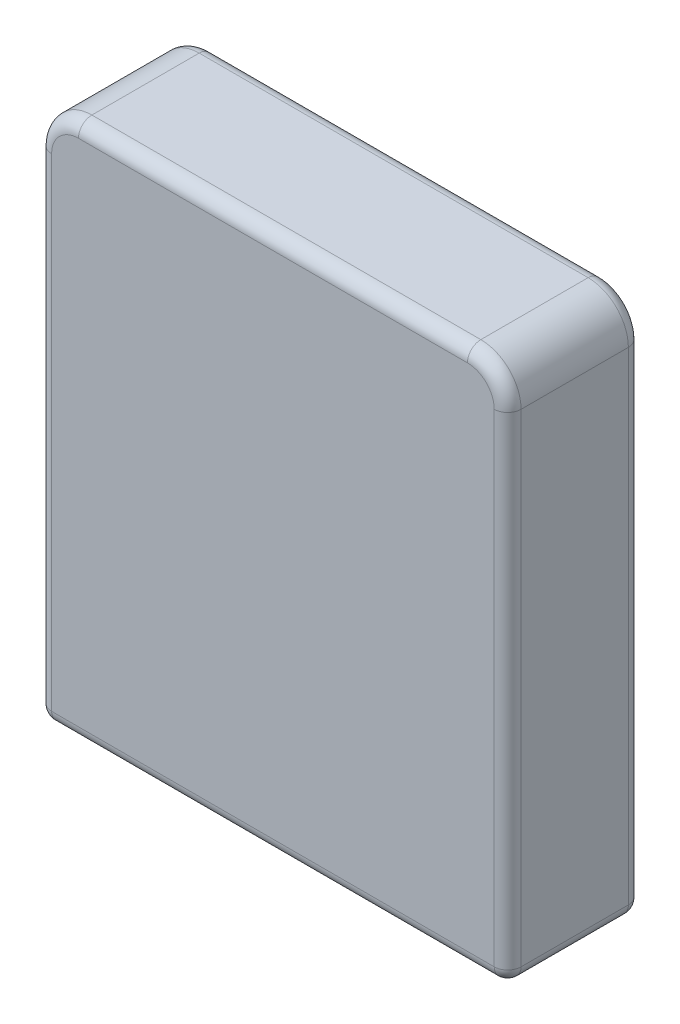
ISO-10303-21;
HEADER;
FILE_DESCRIPTION(('STEP AP214'),'2;1');
FILE_NAME('part.step','',(''),(''),'','','');
FILE_SCHEMA(('AUTOMOTIVE_DESIGN { 1 0 10303 214 1 1 1 1 }'));
ENDSEC;
DATA;
#1=APPLICATION_CONTEXT('core data for automotive mechanical design processes');
#2=APPLICATION_PROTOCOL_DEFINITION('international standard','automotive_design',2000,#1);
#3=PRODUCT_CONTEXT('',#1,'mechanical');
#4=PRODUCT('Part','Part','',(#3));
#5=PRODUCT_RELATED_PRODUCT_CATEGORY('part','',(#4));
#6=PRODUCT_DEFINITION_FORMATION('','',#4);
#7=PRODUCT_DEFINITION_CONTEXT('part definition',#1,'design');
#8=PRODUCT_DEFINITION('design','',#6,#7);
#9=PRODUCT_DEFINITION_SHAPE('','',#8);
#10=(LENGTH_UNIT() NAMED_UNIT(*) SI_UNIT(.MILLI.,.METRE.));
#11=(NAMED_UNIT(*) PLANE_ANGLE_UNIT() SI_UNIT($,.RADIAN.));
#12=(NAMED_UNIT(*) SI_UNIT($,.STERADIAN.) SOLID_ANGLE_UNIT());
#13=UNCERTAINTY_MEASURE_WITH_UNIT(LENGTH_MEASURE(1.E-05),#10,'distance_accuracy_value','');
#14=(GEOMETRIC_REPRESENTATION_CONTEXT(3) GLOBAL_UNCERTAINTY_ASSIGNED_CONTEXT((#13)) GLOBAL_UNIT_ASSIGNED_CONTEXT((#10,
#11,#12)) REPRESENTATION_CONTEXT('',''));
#15=CARTESIAN_POINT('',(0.,0.,0.));
#16=DIRECTION('',(0.,0.,1.));
#17=DIRECTION('',(1.,0.,0.));
#18=AXIS2_PLACEMENT_3D('',#15,#16,#17);
#19=CARTESIAN_POINT('',(0.,0.,10.));
#20=DIRECTION('',(1.,0.,0.));
#21=DIRECTION('',(0.,1.,0.));
#22=AXIS2_PLACEMENT_3D('',#19,#20,#21);
#23=PLANE('',#22);
#24=DIRECTION('',(0.,0.,-1.));
#25=VECTOR('',#24,1.);
#26=CARTESIAN_POINT('',(0.,1.,10.));
#27=LINE('',#26,#25);
#28=CARTESIAN_POINT('',(0.,1.,0.999999999999999));
#29=VERTEX_POINT('',#28);
#30=CARTESIAN_POINT('',(0.,1.,9.));
#31=VERTEX_POINT('',#30);
#32=EDGE_CURVE('E280',#29,#31,#27,.F.);
#33=ORIENTED_EDGE('',*,*,#32,.T.);
#34=DIRECTION('',(0.,-1.,0.));
#35=VECTOR('',#34,1.);
#36=CARTESIAN_POINT('',(0.,0.,9.));
#37=LINE('',#36,#35);
#38=CARTESIAN_POINT('',(0.,37.,9.));
#39=VERTEX_POINT('',#38);
#40=EDGE_CURVE('E284',#31,#39,#37,.F.);
#41=ORIENTED_EDGE('',*,*,#40,.T.);
#42=DIRECTION('',(0.,0.,-1.));
#43=VECTOR('',#42,1.);
#44=CARTESIAN_POINT('',(0.,37.,10.));
#45=LINE('',#44,#43);
#46=CARTESIAN_POINT('',(0.,37.,0.999999999999999));
#47=VERTEX_POINT('',#46);
#48=EDGE_CURVE('E267',#39,#47,#45,.T.);
#49=ORIENTED_EDGE('',*,*,#48,.T.);
#50=DIRECTION('',(0.,-1.,0.));
#51=VECTOR('',#50,1.);
#52=CARTESIAN_POINT('',(0.,0.,0.999999999999999));
#53=LINE('',#52,#51);
#54=EDGE_CURVE('E282',#47,#29,#53,.T.);
#55=ORIENTED_EDGE('',*,*,#54,.T.);
#56=EDGE_LOOP('',(#33,#41,#49,#55));
#57=FACE_BOUND('',#56,.T.);
#58=ADVANCED_FACE('F35',(#57),#23,.F.);
#59=CARTESIAN_POINT('',(0.,0.,10.));
#60=DIRECTION('',(0.,1.,0.));
#61=DIRECTION('',(0.,0.,1.));
#62=AXIS2_PLACEMENT_3D('',#59,#60,#61);
#63=PLANE('',#62);
#64=DIRECTION('',(1.,0.,0.));
#65=VECTOR('',#64,1.);
#66=CARTESIAN_POINT('',(0.,0.,9.));
#67=LINE('',#66,#65);
#68=CARTESIAN_POINT('',(34.,0.,9.));
#69=VERTEX_POINT('',#68);
#70=CARTESIAN_POINT('',(1.,0.,9.));
#71=VERTEX_POINT('',#70);
#72=EDGE_CURVE('E326',#69,#71,#67,.F.);
#73=ORIENTED_EDGE('',*,*,#72,.T.);
#74=DIRECTION('',(0.,0.,-1.));
#75=VECTOR('',#74,1.);
#76=CARTESIAN_POINT('',(1.,0.,10.));
#77=LINE('',#76,#75);
#78=CARTESIAN_POINT('',(1.,0.,0.999999999999999));
#79=VERTEX_POINT('',#78);
#80=EDGE_CURVE('E328',#71,#79,#77,.T.);
#81=ORIENTED_EDGE('',*,*,#80,.T.);
#82=DIRECTION('',(1.,0.,0.));
#83=VECTOR('',#82,1.);
#84=CARTESIAN_POINT('',(4.5,0.,0.999999999999999));
#85=LINE('',#84,#83);
#86=CARTESIAN_POINT('',(4.5,0.,0.999999999999999));
#87=VERTEX_POINT('',#86);
#88=EDGE_CURVE('E314',#79,#87,#85,.T.);
#89=ORIENTED_EDGE('',*,*,#88,.T.);
#90=CARTESIAN_POINT('',(4.5,0.,-1.));
#91=DIRECTION('',(0.,1.,0.));
#92=DIRECTION('',(0.,0.,1.));
#93=AXIS2_PLACEMENT_3D('',#90,#91,#92);
#94=CIRCLE('',#93,2.);
#95=CARTESIAN_POINT('',(6.5,0.,-1.));
#96=VERTEX_POINT('',#95);
#97=EDGE_CURVE('E316',#87,#96,#94,.T.);
#98=ORIENTED_EDGE('',*,*,#97,.T.);
#99=DIRECTION('',(1.,0.,0.));
#100=VECTOR('',#99,1.);
#101=CARTESIAN_POINT('',(28.5,0.,-1.));
#102=LINE('',#101,#100);
#103=CARTESIAN_POINT('',(28.5,0.,-1.));
#104=VERTEX_POINT('',#103);
#105=EDGE_CURVE('E318',#96,#104,#102,.T.);
#106=ORIENTED_EDGE('',*,*,#105,.T.);
#107=CARTESIAN_POINT('',(30.5,0.,-1.));
#108=DIRECTION('',(0.,1.,0.));
#109=DIRECTION('',(0.,0.,1.));
#110=AXIS2_PLACEMENT_3D('',#107,#108,#109);
#111=CIRCLE('',#110,2.);
#112=CARTESIAN_POINT('',(30.5,0.,1.));
#113=VERTEX_POINT('',#112);
#114=EDGE_CURVE('E320',#104,#113,#111,.T.);
#115=ORIENTED_EDGE('',*,*,#114,.T.);
#116=DIRECTION('',(1.,0.,0.));
#117=VECTOR('',#116,1.);
#118=CARTESIAN_POINT('',(35.,0.,0.999999999999999));
#119=LINE('',#118,#117);
#120=CARTESIAN_POINT('',(34.,0.,0.999999999999999));
#121=VERTEX_POINT('',#120);
#122=EDGE_CURVE('E322',#113,#121,#119,.T.);
#123=ORIENTED_EDGE('',*,*,#122,.T.);
#124=DIRECTION('',(0.,0.,-1.));
#125=VECTOR('',#124,1.);
#126=CARTESIAN_POINT('',(34.,0.,10.));
#127=LINE('',#126,#125);
#128=EDGE_CURVE('E324',#121,#69,#127,.F.);
#129=ORIENTED_EDGE('',*,*,#128,.T.);
#130=EDGE_LOOP('',(#73,#81,#89,#98,#106,#115,#123,#129));
#131=FACE_BOUND('',#130,.T.);
#132=ADVANCED_FACE('F525',(#131),#63,.F.);
#133=CARTESIAN_POINT('',(35.,0.,10.));
#134=DIRECTION('',(-1.,0.,0.));
#135=DIRECTION('',(0.,-1.,0.));
#136=AXIS2_PLACEMENT_3D('',#133,#134,#135);
#137=PLANE('',#136);
#138=DIRECTION('',(0.,0.,-1.));
#139=VECTOR('',#138,1.);
#140=CARTESIAN_POINT('',(35.,37.,10.));
#141=LINE('',#140,#139);
#142=CARTESIAN_POINT('',(35.,37.,0.999999999999999));
#143=VERTEX_POINT('',#142);
#144=CARTESIAN_POINT('',(35.,37.,9.));
#145=VERTEX_POINT('',#144);
#146=EDGE_CURVE('E209',#143,#145,#141,.F.);
#147=ORIENTED_EDGE('',*,*,#146,.T.);
#148=DIRECTION('',(0.,1.,0.));
#149=VECTOR('',#148,1.);
#150=CARTESIAN_POINT('',(35.,0.,9.));
#151=LINE('',#150,#149);
#152=CARTESIAN_POINT('',(35.,1.,9.));
#153=VERTEX_POINT('',#152);
#154=EDGE_CURVE('E335',#145,#153,#151,.F.);
#155=ORIENTED_EDGE('',*,*,#154,.T.);
#156=DIRECTION('',(0.,0.,-1.));
#157=VECTOR('',#156,1.);
#158=CARTESIAN_POINT('',(35.,1.,10.));
#159=LINE('',#158,#157);
#160=CARTESIAN_POINT('',(35.,1.,0.999999999999999));
#161=VERTEX_POINT('',#160);
#162=EDGE_CURVE('E333',#153,#161,#159,.T.);
#163=ORIENTED_EDGE('',*,*,#162,.T.);
#164=DIRECTION('',(0.,1.,0.));
#165=VECTOR('',#164,1.);
#166=CARTESIAN_POINT('',(35.,37.,0.999999999999999));
#167=LINE('',#166,#165);
#168=EDGE_CURVE('E331',#161,#143,#167,.T.);
#169=ORIENTED_EDGE('',*,*,#168,.T.);
#170=EDGE_LOOP('',(#147,#155,#163,#169));
#171=FACE_BOUND('',#170,.T.);
#172=ADVANCED_FACE('F495',(#171),#137,.F.);
#173=CARTESIAN_POINT('',(0.,40.,10.));
#174=DIRECTION('',(0.,-1.,0.));
#175=DIRECTION('',(0.,0.,-1.));
#176=AXIS2_PLACEMENT_3D('',#173,#174,#175);
#177=PLANE('',#176);
#178=DIRECTION('',(0.,0.,-1.));
#179=VECTOR('',#178,1.);
#180=CARTESIAN_POINT('',(2.99999999999999,40.,10.));
#181=LINE('',#180,#179);
#182=CARTESIAN_POINT('',(2.99999999999999,40.,0.999999999999999));
#183=VERTEX_POINT('',#182);
#184=CARTESIAN_POINT('',(2.99999999999999,40.,9.));
#185=VERTEX_POINT('',#184);
#186=EDGE_CURVE('E482',#183,#185,#181,.F.);
#187=ORIENTED_EDGE('',*,*,#186,.T.);
#188=DIRECTION('',(-1.,0.,0.));
#189=VECTOR('',#188,1.);
#190=CARTESIAN_POINT('',(0.,40.,9.));
#191=LINE('',#190,#189);
#192=CARTESIAN_POINT('',(32.,40.,9.));
#193=VERTEX_POINT('',#192);
#194=EDGE_CURVE('E293',#185,#193,#191,.F.);
#195=ORIENTED_EDGE('',*,*,#194,.T.);
#196=DIRECTION('',(0.,0.,-1.));
#197=VECTOR('',#196,1.);
#198=CARTESIAN_POINT('',(32.,40.,10.));
#199=LINE('',#198,#197);
#200=CARTESIAN_POINT('',(32.,40.,0.999999999999999));
#201=VERTEX_POINT('',#200);
#202=EDGE_CURVE('E485',#193,#201,#199,.T.);
#203=ORIENTED_EDGE('',*,*,#202,.T.);
#204=DIRECTION('',(-1.,0.,0.));
#205=VECTOR('',#204,1.);
#206=CARTESIAN_POINT('',(2.99999999999999,40.,0.999999999999999));
#207=LINE('',#206,#205);
#208=EDGE_CURVE('E291',#201,#183,#207,.T.);
#209=ORIENTED_EDGE('',*,*,#208,.T.);
#210=EDGE_LOOP('',(#187,#195,#203,#209));
#211=FACE_BOUND('',#210,.T.);
#212=ADVANCED_FACE('F594',(#211),#177,.F.);
#213=CARTESIAN_POINT('',(0.,0.,10.));
#214=DIRECTION('',(0.,0.,-1.));
#215=DIRECTION('',(-1.,0.,0.));
#216=AXIS2_PLACEMENT_3D('',#213,#214,#215);
#217=PLANE('',#216);
#218=CARTESIAN_POINT('',(2.99999999999999,37.,10.));
#219=DIRECTION('',(0.,0.,-1.));
#220=DIRECTION('',(-1.,0.,0.));
#221=AXIS2_PLACEMENT_3D('',#218,#219,#220);
#222=CIRCLE('',#221,2.);
#223=CARTESIAN_POINT('',(2.99999999999999,39.,10.));
#224=VERTEX_POINT('',#223);
#225=CARTESIAN_POINT('',(0.999999999999994,37.,10.));
#226=VERTEX_POINT('',#225);
#227=EDGE_CURVE('E275',#224,#226,#222,.F.);
#228=ORIENTED_EDGE('',*,*,#227,.T.);
#229=DIRECTION('',(0.,-1.,0.));
#230=VECTOR('',#229,1.);
#231=CARTESIAN_POINT('',(1.,0.,10.));
#232=LINE('',#231,#230);
#233=CARTESIAN_POINT('',(1.,1.,10.));
#234=VERTEX_POINT('',#233);
#235=EDGE_CURVE('E277',#226,#234,#232,.T.);
#236=ORIENTED_EDGE('',*,*,#235,.T.);
#237=DIRECTION('',(1.,0.,0.));
#238=VECTOR('',#237,1.);
#239=CARTESIAN_POINT('',(0.,1.,10.));
#240=LINE('',#239,#238);
#241=CARTESIAN_POINT('',(34.,1.,10.));
#242=VERTEX_POINT('',#241);
#243=EDGE_CURVE('E269',#234,#242,#240,.T.);
#244=ORIENTED_EDGE('',*,*,#243,.T.);
#245=DIRECTION('',(0.,1.,0.));
#246=VECTOR('',#245,1.);
#247=CARTESIAN_POINT('',(34.,0.,10.));
#248=LINE('',#247,#246);
#249=CARTESIAN_POINT('',(34.,37.,10.));
#250=VERTEX_POINT('',#249);
#251=EDGE_CURVE('E240',#242,#250,#248,.T.);
#252=ORIENTED_EDGE('',*,*,#251,.T.);
#253=CARTESIAN_POINT('',(32.,37.,10.));
#254=DIRECTION('',(0.,0.,-1.));
#255=DIRECTION('',(-1.,0.,0.));
#256=AXIS2_PLACEMENT_3D('',#253,#254,#255);
#257=CIRCLE('',#256,2.);
#258=CARTESIAN_POINT('',(32.,39.,10.));
#259=VERTEX_POINT('',#258);
#260=EDGE_CURVE('E271',#250,#259,#257,.F.);
#261=ORIENTED_EDGE('',*,*,#260,.T.);
#262=DIRECTION('',(-1.,0.,0.));
#263=VECTOR('',#262,1.);
#264=CARTESIAN_POINT('',(0.,39.,10.));
#265=LINE('',#264,#263);
#266=EDGE_CURVE('E273',#259,#224,#265,.T.);
#267=ORIENTED_EDGE('',*,*,#266,.T.);
#268=EDGE_LOOP('',(#228,#236,#244,#252,#261,#267));
#269=FACE_BOUND('',#268,.T.);
#270=ADVANCED_FACE('F512',(#269),#217,.F.);
#271=CARTESIAN_POINT('',(0.,0.,0.));
#272=DIRECTION('',(0.,0.,-1.));
#273=DIRECTION('',(-1.,0.,0.));
#274=AXIS2_PLACEMENT_3D('',#271,#272,#273);
#275=PLANE('',#274);
#276=DIRECTION('',(0.,-1.,0.));
#277=VECTOR('',#276,1.);
#278=CARTESIAN_POINT('',(4.5,0.,0.));
#279=LINE('',#278,#277);
#280=CARTESIAN_POINT('',(4.5,33.,0.));
#281=VERTEX_POINT('',#280);
#282=CARTESIAN_POINT('',(4.5,1.,0.));
#283=VERTEX_POINT('',#282);
#284=EDGE_CURVE('E229',#281,#283,#279,.T.);
#285=ORIENTED_EDGE('',*,*,#284,.T.);
#286=DIRECTION('',(1.,0.,0.));
#287=VECTOR('',#286,1.);
#288=CARTESIAN_POINT('',(0.,1.,0.));
#289=LINE('',#288,#287);
#290=CARTESIAN_POINT('',(1.,1.,0.));
#291=VERTEX_POINT('',#290);
#292=EDGE_CURVE('E312',#283,#291,#289,.F.);
#293=ORIENTED_EDGE('',*,*,#292,.T.);
#294=DIRECTION('',(0.,-1.,0.));
#295=VECTOR('',#294,1.);
#296=CARTESIAN_POINT('',(0.999999999999994,37.,0.));
#297=LINE('',#296,#295);
#298=CARTESIAN_POINT('',(0.999999999999994,37.,0.));
#299=VERTEX_POINT('',#298);
#300=EDGE_CURVE('E309',#291,#299,#297,.F.);
#301=ORIENTED_EDGE('',*,*,#300,.T.);
#302=CARTESIAN_POINT('',(2.99999999999999,37.,0.));
#303=DIRECTION('',(0.,0.,-1.));
#304=DIRECTION('',(-1.,0.,0.));
#305=AXIS2_PLACEMENT_3D('',#302,#303,#304);
#306=CIRCLE('',#305,2.);
#307=CARTESIAN_POINT('',(2.99999999999999,39.,0.));
#308=VERTEX_POINT('',#307);
#309=EDGE_CURVE('E307',#299,#308,#306,.T.);
#310=ORIENTED_EDGE('',*,*,#309,.T.);
#311=DIRECTION('',(-1.,0.,0.));
#312=VECTOR('',#311,1.);
#313=CARTESIAN_POINT('',(32.,39.,0.));
#314=LINE('',#313,#312);
#315=CARTESIAN_POINT('',(32.,39.,0.));
#316=VERTEX_POINT('',#315);
#317=EDGE_CURVE('E305',#308,#316,#314,.F.);
#318=ORIENTED_EDGE('',*,*,#317,.T.);
#319=CARTESIAN_POINT('',(32.,37.,0.));
#320=DIRECTION('',(0.,0.,-1.));
#321=DIRECTION('',(-1.,0.,0.));
#322=AXIS2_PLACEMENT_3D('',#319,#320,#321);
#323=CIRCLE('',#322,2.);
#324=CARTESIAN_POINT('',(34.,37.,0.));
#325=VERTEX_POINT('',#324);
#326=EDGE_CURVE('E303',#316,#325,#323,.T.);
#327=ORIENTED_EDGE('',*,*,#326,.T.);
#328=DIRECTION('',(0.,1.,0.));
#329=VECTOR('',#328,1.);
#330=CARTESIAN_POINT('',(34.,0.,0.));
#331=LINE('',#330,#329);
#332=CARTESIAN_POINT('',(34.,1.,0.));
#333=VERTEX_POINT('',#332);
#334=EDGE_CURVE('E299',#325,#333,#331,.F.);
#335=ORIENTED_EDGE('',*,*,#334,.T.);
#336=DIRECTION('',(1.,0.,0.));
#337=VECTOR('',#336,1.);
#338=CARTESIAN_POINT('',(30.5,1.,0.));
#339=LINE('',#338,#337);
#340=CARTESIAN_POINT('',(30.5,1.,0.));
#341=VERTEX_POINT('',#340);
#342=EDGE_CURVE('E301',#333,#341,#339,.F.);
#343=ORIENTED_EDGE('',*,*,#342,.T.);
#344=DIRECTION('',(0.,-1.,0.));
#345=VECTOR('',#344,1.);
#346=CARTESIAN_POINT('',(30.5,34.,0.));
#347=LINE('',#346,#345);
#348=CARTESIAN_POINT('',(30.5,33.,0.));
#349=VERTEX_POINT('',#348);
#350=EDGE_CURVE('E205',#341,#349,#347,.F.);
#351=ORIENTED_EDGE('',*,*,#350,.T.);
#352=CARTESIAN_POINT('',(28.5,33.,0.));
#353=DIRECTION('',(0.,0.,-1.));
#354=DIRECTION('',(-1.,0.,0.));
#355=AXIS2_PLACEMENT_3D('',#352,#353,#354);
#356=CIRCLE('',#355,2.);
#357=CARTESIAN_POINT('',(28.5,35.,0.));
#358=VERTEX_POINT('',#357);
#359=EDGE_CURVE('E197',#358,#349,#356,.T.);
#360=ORIENTED_EDGE('',*,*,#359,.F.);
#361=DIRECTION('',(-1.,0.,0.));
#362=VECTOR('',#361,1.);
#363=CARTESIAN_POINT('',(0.,35.,0.));
#364=LINE('',#363,#362);
#365=CARTESIAN_POINT('',(6.5,35.,0.));
#366=VERTEX_POINT('',#365);
#367=EDGE_CURVE('E202',#358,#366,#364,.T.);
#368=ORIENTED_EDGE('',*,*,#367,.T.);
#369=CARTESIAN_POINT('',(6.5,33.,0.));
#370=DIRECTION('',(0.,0.,-1.));
#371=DIRECTION('',(-1.,0.,0.));
#372=AXIS2_PLACEMENT_3D('',#369,#370,#371);
#373=CIRCLE('',#372,2.);
#374=EDGE_CURVE('E227',#281,#366,#373,.T.);
#375=ORIENTED_EDGE('',*,*,#374,.F.);
#376=EDGE_LOOP('',(#285,#293,#301,#310,#318,#327,#335,#343,#351,#360,#368,#375));
#377=FACE_BOUND('',#376,.T.);
#378=ADVANCED_FACE('F200',(#377),#275,.T.);
#379=CARTESIAN_POINT('',(2.99999999999999,37.,10.));
#380=DIRECTION('',(0.,0.,-1.));
#381=DIRECTION('',(-1.,0.,0.));
#382=AXIS2_PLACEMENT_3D('',#379,#380,#381);
#383=CYLINDRICAL_SURFACE('',#382,3.);
#384=ORIENTED_EDGE('',*,*,#48,.F.);
#385=CARTESIAN_POINT('',(2.99999999999999,37.,9.));
#386=DIRECTION('',(0.,0.,-1.));
#387=DIRECTION('',(-1.,0.,0.));
#388=AXIS2_PLACEMENT_3D('',#385,#386,#387);
#389=CIRCLE('',#388,3.);
#390=EDGE_CURVE('E289',#39,#185,#389,.T.);
#391=ORIENTED_EDGE('',*,*,#390,.T.);
#392=ORIENTED_EDGE('',*,*,#186,.F.);
#393=CARTESIAN_POINT('',(2.99999999999999,37.,0.999999999999999));
#394=DIRECTION('',(0.,0.,-1.));
#395=DIRECTION('',(-1.,0.,0.));
#396=AXIS2_PLACEMENT_3D('',#393,#394,#395);
#397=CIRCLE('',#396,3.);
#398=EDGE_CURVE('E287',#183,#47,#397,.F.);
#399=ORIENTED_EDGE('',*,*,#398,.T.);
#400=EDGE_LOOP('',(#384,#391,#392,#399));
#401=FACE_BOUND('',#400,.T.);
#402=ADVANCED_FACE('F480',(#401),#383,.T.);
#403=CARTESIAN_POINT('',(32.,37.,10.));
#404=DIRECTION('',(0.,0.,-1.));
#405=DIRECTION('',(-1.,0.,0.));
#406=AXIS2_PLACEMENT_3D('',#403,#404,#405);
#407=CYLINDRICAL_SURFACE('',#406,3.);
#408=ORIENTED_EDGE('',*,*,#202,.F.);
#409=CARTESIAN_POINT('',(32.,37.,9.));
#410=DIRECTION('',(0.,0.,-1.));
#411=DIRECTION('',(-1.,0.,0.));
#412=AXIS2_PLACEMENT_3D('',#409,#410,#411);
#413=CIRCLE('',#412,3.);
#414=EDGE_CURVE('E297',#193,#145,#413,.T.);
#415=ORIENTED_EDGE('',*,*,#414,.T.);
#416=ORIENTED_EDGE('',*,*,#146,.F.);
#417=CARTESIAN_POINT('',(32.,37.,0.999999999999999));
#418=DIRECTION('',(0.,0.,-1.));
#419=DIRECTION('',(-1.,0.,0.));
#420=AXIS2_PLACEMENT_3D('',#417,#418,#419);
#421=CIRCLE('',#420,3.);
#422=EDGE_CURVE('E295',#143,#201,#421,.F.);
#423=ORIENTED_EDGE('',*,*,#422,.T.);
#424=EDGE_LOOP('',(#408,#415,#416,#423));
#425=FACE_BOUND('',#424,.T.);
#426=ADVANCED_FACE('F559',(#425),#407,.T.);
#427=CARTESIAN_POINT('',(5.5,34.,-2.));
#428=DIRECTION('',(0.,0.,-1.));
#429=DIRECTION('',(-1.,0.,0.));
#430=AXIS2_PLACEMENT_3D('',#427,#428,#429);
#431=PLANE('',#430);
#432=DIRECTION('',(0.,-1.,0.));
#433=VECTOR('',#432,1.);
#434=CARTESIAN_POINT('',(28.5,34.,-2.));
#435=LINE('',#434,#433);
#436=CARTESIAN_POINT('',(28.5,33.,-2.));
#437=VERTEX_POINT('',#436);
#438=CARTESIAN_POINT('',(28.5,1.,-2.));
#439=VERTEX_POINT('',#438);
#440=EDGE_CURVE('E234',#437,#439,#435,.T.);
#441=ORIENTED_EDGE('',*,*,#440,.T.);
#442=DIRECTION('',(1.,0.,0.));
#443=VECTOR('',#442,1.);
#444=CARTESIAN_POINT('',(6.5,1.,-2.));
#445=LINE('',#444,#443);
#446=CARTESIAN_POINT('',(6.5,1.,-2.));
#447=VERTEX_POINT('',#446);
#448=EDGE_CURVE('E59',#439,#447,#445,.F.);
#449=ORIENTED_EDGE('',*,*,#448,.T.);
#450=DIRECTION('',(0.,-1.,0.));
#451=VECTOR('',#450,1.);
#452=CARTESIAN_POINT('',(6.5,34.,-2.));
#453=LINE('',#452,#451);
#454=CARTESIAN_POINT('',(6.5,33.,-2.));
#455=VERTEX_POINT('',#454);
#456=EDGE_CURVE('E238',#447,#455,#453,.F.);
#457=ORIENTED_EDGE('',*,*,#456,.T.);
#458=DIRECTION('',(1.,0.,0.));
#459=VECTOR('',#458,1.);
#460=CARTESIAN_POINT('',(29.5,33.,-2.));
#461=LINE('',#460,#459);
#462=EDGE_CURVE('E236',#455,#437,#461,.T.);
#463=ORIENTED_EDGE('',*,*,#462,.T.);
#464=EDGE_LOOP('',(#441,#449,#457,#463));
#465=FACE_BOUND('',#464,.T.);
#466=ADVANCED_FACE('F429',(#465),#431,.T.);
#467=CARTESIAN_POINT('',(28.5,34.,-1.));
#468=DIRECTION('',(0.,-1.,0.));
#469=DIRECTION('',(0.,0.,-1.));
#470=AXIS2_PLACEMENT_3D('',#467,#468,#469);
#471=CYLINDRICAL_SURFACE('',#470,1.);
#472=DIRECTION('',(0.,-1.,0.));
#473=VECTOR('',#472,1.);
#474=CARTESIAN_POINT('',(29.5,34.,-1.));
#475=LINE('',#474,#473);
#476=CARTESIAN_POINT('',(29.5,1.,-1.));
#477=VERTEX_POINT('',#476);
#478=CARTESIAN_POINT('',(29.5,33.,-1.));
#479=VERTEX_POINT('',#478);
#480=EDGE_CURVE('E261',#477,#479,#475,.F.);
#481=ORIENTED_EDGE('',*,*,#480,.F.);
#482=CARTESIAN_POINT('',(28.5,1.,-1.));
#483=DIRECTION('',(0.,-1.,0.));
#484=DIRECTION('',(0.,0.,-1.));
#485=AXIS2_PLACEMENT_3D('',#482,#483,#484);
#486=CIRCLE('',#485,1.);
#487=EDGE_CURVE('E339',#477,#439,#486,.F.);
#488=ORIENTED_EDGE('',*,*,#487,.T.);
#489=ORIENTED_EDGE('',*,*,#440,.F.);
#490=CARTESIAN_POINT('',(28.5,33.,-1.));
#491=DIRECTION('',(0.,1.,0.));
#492=DIRECTION('',(0.,0.,1.));
#493=AXIS2_PLACEMENT_3D('',#490,#491,#492);
#494=CIRCLE('',#493,1.);
#495=EDGE_CURVE('E264',#479,#437,#494,.T.);
#496=ORIENTED_EDGE('',*,*,#495,.F.);
#497=EDGE_LOOP('',(#481,#488,#489,#496));
#498=FACE_BOUND('',#497,.T.);
#499=ADVANCED_FACE('F427',(#498),#471,.T.);
#500=CARTESIAN_POINT('',(28.5,33.,-1.));
#501=DIRECTION('',(0.,0.,1.));
#502=DIRECTION('',(1.,0.,0.));
#503=AXIS2_PLACEMENT_3D('',#500,#501,#502);
#504=SPHERICAL_SURFACE('',#503,1.);
#505=CARTESIAN_POINT('',(28.5,33.,-1.));
#506=DIRECTION('',(0.,0.,-1.));
#507=DIRECTION('',(-1.,0.,0.));
#508=AXIS2_PLACEMENT_3D('',#505,#506,#507);
#509=CIRCLE('',#508,1.);
#510=CARTESIAN_POINT('',(28.5,34.,-1.));
#511=VERTEX_POINT('',#510);
#512=EDGE_CURVE('E216',#479,#511,#509,.F.);
#513=ORIENTED_EDGE('',*,*,#512,.F.);
#514=ORIENTED_EDGE('',*,*,#495,.T.);
#515=CARTESIAN_POINT('',(28.5,33.,-1.));
#516=DIRECTION('',(1.,0.,0.));
#517=DIRECTION('',(0.,0.,-1.));
#518=AXIS2_PLACEMENT_3D('',#515,#516,#517);
#519=CIRCLE('',#518,1.);
#520=EDGE_CURVE('E258',#511,#437,#519,.F.);
#521=ORIENTED_EDGE('',*,*,#520,.F.);
#522=EDGE_LOOP('',(#513,#514,#521));
#523=FACE_BOUND('',#522,.T.);
#524=ADVANCED_FACE('F579',(#523),#504,.T.);
#525=CARTESIAN_POINT('',(30.5,34.,-1.));
#526=DIRECTION('',(0.,1.,0.));
#527=DIRECTION('',(0.,0.,1.));
#528=AXIS2_PLACEMENT_3D('',#525,#526,#527);
#529=CYLINDRICAL_SURFACE('',#528,1.);
#530=ORIENTED_EDGE('',*,*,#350,.F.);
#531=CARTESIAN_POINT('',(30.5,1.,-1.));
#532=DIRECTION('',(0.,1.,0.));
#533=DIRECTION('',(0.,0.,1.));
#534=AXIS2_PLACEMENT_3D('',#531,#532,#533);
#535=CIRCLE('',#534,1.);
#536=EDGE_CURVE('E337',#341,#477,#535,.F.);
#537=ORIENTED_EDGE('',*,*,#536,.T.);
#538=ORIENTED_EDGE('',*,*,#480,.T.);
#539=CARTESIAN_POINT('',(30.5,33.,-1.));
#540=DIRECTION('',(0.,-1.,0.));
#541=DIRECTION('',(0.,0.,-1.));
#542=AXIS2_PLACEMENT_3D('',#539,#540,#541);
#543=CIRCLE('',#542,1.);
#544=EDGE_CURVE('E256',#349,#479,#543,.T.);
#545=ORIENTED_EDGE('',*,*,#544,.F.);
#546=EDGE_LOOP('',(#530,#537,#538,#545));
#547=FACE_BOUND('',#546,.T.);
#548=ADVANCED_FACE('F576',(#547),#529,.F.);
#549=CARTESIAN_POINT('',(5.5,33.,-1.));
#550=DIRECTION('',(-1.,0.,0.));
#551=DIRECTION('',(0.,0.,1.));
#552=AXIS2_PLACEMENT_3D('',#549,#550,#551);
#553=CYLINDRICAL_SURFACE('',#552,1.);
#554=ORIENTED_EDGE('',*,*,#520,.T.);
#555=ORIENTED_EDGE('',*,*,#462,.F.);
#556=CARTESIAN_POINT('',(6.5,33.,-1.));
#557=DIRECTION('',(-1.,0.,0.));
#558=DIRECTION('',(0.,0.,1.));
#559=AXIS2_PLACEMENT_3D('',#556,#557,#558);
#560=CIRCLE('',#559,1.);
#561=CARTESIAN_POINT('',(6.5,34.,-1.));
#562=VERTEX_POINT('',#561);
#563=EDGE_CURVE('E253',#562,#455,#560,.T.);
#564=ORIENTED_EDGE('',*,*,#563,.F.);
#565=DIRECTION('',(1.,0.,0.));
#566=VECTOR('',#565,1.);
#567=CARTESIAN_POINT('',(5.5,34.,-1.));
#568=LINE('',#567,#566);
#569=EDGE_CURVE('E220',#511,#562,#568,.F.);
#570=ORIENTED_EDGE('',*,*,#569,.F.);
#571=EDGE_LOOP('',(#554,#555,#564,#570));
#572=FACE_BOUND('',#571,.T.);
#573=ADVANCED_FACE('F432',(#572),#553,.T.);
#574=CARTESIAN_POINT('',(28.5,33.,-1.));
#575=DIRECTION('',(0.,0.,-1.));
#576=DIRECTION('',(-1.,0.,0.));
#577=AXIS2_PLACEMENT_3D('',#574,#575,#576);
#578=TOROIDAL_SURFACE('',#577,2.,1.);
#579=ORIENTED_EDGE('',*,*,#544,.T.);
#580=ORIENTED_EDGE('',*,*,#512,.T.);
#581=CARTESIAN_POINT('',(28.5,35.,-1.));
#582=DIRECTION('',(-1.,0.,0.));
#583=DIRECTION('',(0.,0.,1.));
#584=AXIS2_PLACEMENT_3D('',#581,#582,#583);
#585=CIRCLE('',#584,1.);
#586=EDGE_CURVE('E213',#358,#511,#585,.F.);
#587=ORIENTED_EDGE('',*,*,#586,.F.);
#588=ORIENTED_EDGE('',*,*,#359,.T.);
#589=EDGE_LOOP('',(#579,#580,#587,#588));
#590=FACE_BOUND('',#589,.T.);
#591=ADVANCED_FACE('F214',(#590),#578,.F.);
#592=CARTESIAN_POINT('',(6.5,33.,-1.));
#593=DIRECTION('',(0.,0.,1.));
#594=DIRECTION('',(1.,0.,0.));
#595=AXIS2_PLACEMENT_3D('',#592,#593,#594);
#596=SPHERICAL_SURFACE('',#595,1.);
#597=CARTESIAN_POINT('',(6.5,33.,-1.));
#598=DIRECTION('',(0.,0.,-1.));
#599=DIRECTION('',(-1.,0.,0.));
#600=AXIS2_PLACEMENT_3D('',#597,#598,#599);
#601=CIRCLE('',#600,1.);
#602=CARTESIAN_POINT('',(5.5,33.,-1.));
#603=VERTEX_POINT('',#602);
#604=EDGE_CURVE('E250',#562,#603,#601,.F.);
#605=ORIENTED_EDGE('',*,*,#604,.F.);
#606=ORIENTED_EDGE('',*,*,#563,.T.);
#607=CARTESIAN_POINT('',(6.5,33.,-1.));
#608=DIRECTION('',(0.,1.,0.));
#609=DIRECTION('',(0.,0.,1.));
#610=AXIS2_PLACEMENT_3D('',#607,#608,#609);
#611=CIRCLE('',#610,1.);
#612=EDGE_CURVE('E221',#603,#455,#611,.F.);
#613=ORIENTED_EDGE('',*,*,#612,.F.);
#614=EDGE_LOOP('',(#605,#606,#613));
#615=FACE_BOUND('',#614,.T.);
#616=ADVANCED_FACE('F435',(#615),#596,.T.);
#617=CARTESIAN_POINT('',(0.,35.,-1.));
#618=DIRECTION('',(-1.,0.,0.));
#619=DIRECTION('',(0.,0.,1.));
#620=AXIS2_PLACEMENT_3D('',#617,#618,#619);
#621=CYLINDRICAL_SURFACE('',#620,1.);
#622=ORIENTED_EDGE('',*,*,#586,.T.);
#623=ORIENTED_EDGE('',*,*,#569,.T.);
#624=CARTESIAN_POINT('',(6.5,35.,-1.));
#625=DIRECTION('',(1.,0.,0.));
#626=DIRECTION('',(0.,0.,-1.));
#627=AXIS2_PLACEMENT_3D('',#624,#625,#626);
#628=CIRCLE('',#627,1.);
#629=EDGE_CURVE('E225',#366,#562,#628,.T.);
#630=ORIENTED_EDGE('',*,*,#629,.F.);
#631=ORIENTED_EDGE('',*,*,#367,.F.);
#632=EDGE_LOOP('',(#622,#623,#630,#631));
#633=FACE_BOUND('',#632,.T.);
#634=ADVANCED_FACE('F223',(#633),#621,.F.);
#635=CARTESIAN_POINT('',(6.5,34.,-1.));
#636=DIRECTION('',(0.,-1.,0.));
#637=DIRECTION('',(0.,0.,-1.));
#638=AXIS2_PLACEMENT_3D('',#635,#636,#637);
#639=CYLINDRICAL_SURFACE('',#638,1.);
#640=ORIENTED_EDGE('',*,*,#456,.F.);
#641=CARTESIAN_POINT('',(6.5,1.,-1.));
#642=DIRECTION('',(0.,-1.,0.));
#643=DIRECTION('',(0.,0.,-1.));
#644=AXIS2_PLACEMENT_3D('',#641,#642,#643);
#645=CIRCLE('',#644,1.);
#646=CARTESIAN_POINT('',(5.5,1.,-1.));
#647=VERTEX_POINT('',#646);
#648=EDGE_CURVE('E44',#447,#647,#645,.F.);
#649=ORIENTED_EDGE('',*,*,#648,.T.);
#650=DIRECTION('',(0.,-1.,0.));
#651=VECTOR('',#650,1.);
#652=CARTESIAN_POINT('',(5.5,34.,-1.));
#653=LINE('',#652,#651);
#654=EDGE_CURVE('E244',#603,#647,#653,.T.);
#655=ORIENTED_EDGE('',*,*,#654,.F.);
#656=ORIENTED_EDGE('',*,*,#612,.T.);
#657=EDGE_LOOP('',(#640,#649,#655,#656));
#658=FACE_BOUND('',#657,.T.);
#659=ADVANCED_FACE('F436',(#658),#639,.T.);
#660=CARTESIAN_POINT('',(6.5,33.,-1.));
#661=DIRECTION('',(0.,0.,-1.));
#662=DIRECTION('',(-1.,0.,0.));
#663=AXIS2_PLACEMENT_3D('',#660,#661,#662);
#664=TOROIDAL_SURFACE('',#663,2.,1.);
#665=ORIENTED_EDGE('',*,*,#629,.T.);
#666=ORIENTED_EDGE('',*,*,#604,.T.);
#667=CARTESIAN_POINT('',(4.5,33.,-1.));
#668=DIRECTION('',(0.,-1.,0.));
#669=DIRECTION('',(0.,0.,-1.));
#670=AXIS2_PLACEMENT_3D('',#667,#668,#669);
#671=CIRCLE('',#670,1.);
#672=EDGE_CURVE('E241',#281,#603,#671,.F.);
#673=ORIENTED_EDGE('',*,*,#672,.F.);
#674=ORIENTED_EDGE('',*,*,#374,.T.);
#675=EDGE_LOOP('',(#665,#666,#673,#674));
#676=FACE_BOUND('',#675,.T.);
#677=ADVANCED_FACE('F444',(#676),#664,.F.);
#678=CARTESIAN_POINT('',(4.5,0.,-1.));
#679=DIRECTION('',(0.,1.,0.));
#680=DIRECTION('',(0.,0.,1.));
#681=AXIS2_PLACEMENT_3D('',#678,#679,#680);
#682=CYLINDRICAL_SURFACE('',#681,1.);
#683=ORIENTED_EDGE('',*,*,#654,.T.);
#684=CARTESIAN_POINT('',(4.5,1.,-1.));
#685=DIRECTION('',(0.,1.,0.));
#686=DIRECTION('',(0.,0.,1.));
#687=AXIS2_PLACEMENT_3D('',#684,#685,#686);
#688=CIRCLE('',#687,1.);
#689=EDGE_CURVE('E11',#647,#283,#688,.F.);
#690=ORIENTED_EDGE('',*,*,#689,.T.);
#691=ORIENTED_EDGE('',*,*,#284,.F.);
#692=ORIENTED_EDGE('',*,*,#672,.T.);
#693=EDGE_LOOP('',(#683,#690,#691,#692));
#694=FACE_BOUND('',#693,.T.);
#695=ADVANCED_FACE('F442',(#694),#682,.F.);
#696=CARTESIAN_POINT('',(28.5,1.,-1.));
#697=DIRECTION('',(0.,0.,1.));
#698=DIRECTION('',(1.,0.,0.));
#699=AXIS2_PLACEMENT_3D('',#696,#697,#698);
#700=SPHERICAL_SURFACE('',#699,1.);
#701=CARTESIAN_POINT('',(28.5,1.,-1.));
#702=DIRECTION('',(-1.,0.,0.));
#703=DIRECTION('',(0.,0.,1.));
#704=AXIS2_PLACEMENT_3D('',#701,#702,#703);
#705=CIRCLE('',#704,1.);
#706=EDGE_CURVE('E410',#439,#104,#705,.T.);
#707=ORIENTED_EDGE('',*,*,#706,.F.);
#708=ORIENTED_EDGE('',*,*,#487,.F.);
#709=CARTESIAN_POINT('',(28.5,1.,-1.));
#710=DIRECTION('',(0.,0.,1.));
#711=DIRECTION('',(1.,0.,0.));
#712=AXIS2_PLACEMENT_3D('',#709,#710,#711);
#713=CIRCLE('',#712,1.);
#714=EDGE_CURVE('E39',#104,#477,#713,.T.);
#715=ORIENTED_EDGE('',*,*,#714,.F.);
#716=EDGE_LOOP('',(#707,#708,#715));
#717=FACE_BOUND('',#716,.T.);
#718=ADVANCED_FACE('F37',(#717),#700,.T.);
#719=CARTESIAN_POINT('',(30.5,1.,-1.));
#720=DIRECTION('',(0.,1.,0.));
#721=DIRECTION('',(0.,0.,1.));
#722=AXIS2_PLACEMENT_3D('',#719,#720,#721);
#723=TOROIDAL_SURFACE('',#722,2.,1.);
#724=ORIENTED_EDGE('',*,*,#714,.T.);
#725=ORIENTED_EDGE('',*,*,#536,.F.);
#726=CARTESIAN_POINT('',(30.5,1.,1.));
#727=DIRECTION('',(1.,0.,0.));
#728=DIRECTION('',(0.,0.,-1.));
#729=AXIS2_PLACEMENT_3D('',#726,#727,#728);
#730=CIRCLE('',#729,1.);
#731=EDGE_CURVE('E405',#113,#341,#730,.T.);
#732=ORIENTED_EDGE('',*,*,#731,.F.);
#733=ORIENTED_EDGE('',*,*,#114,.F.);
#734=EDGE_LOOP('',(#724,#725,#732,#733));
#735=FACE_BOUND('',#734,.T.);
#736=ADVANCED_FACE('F420',(#735),#723,.T.);
#737=CARTESIAN_POINT('',(0.,1.,-0.999999999999999));
#738=DIRECTION('',(-1.,0.,0.));
#739=DIRECTION('',(0.,0.,1.));
#740=AXIS2_PLACEMENT_3D('',#737,#738,#739);
#741=CYLINDRICAL_SURFACE('',#740,1.);
#742=ORIENTED_EDGE('',*,*,#706,.T.);
#743=ORIENTED_EDGE('',*,*,#105,.F.);
#744=CARTESIAN_POINT('',(6.5,1.,-1.));
#745=DIRECTION('',(-1.,0.,0.));
#746=DIRECTION('',(0.,0.,1.));
#747=AXIS2_PLACEMENT_3D('',#744,#745,#746);
#748=CIRCLE('',#747,1.);
#749=EDGE_CURVE('E402',#447,#96,#748,.T.);
#750=ORIENTED_EDGE('',*,*,#749,.F.);
#751=ORIENTED_EDGE('',*,*,#448,.F.);
#752=EDGE_LOOP('',(#742,#743,#750,#751));
#753=FACE_BOUND('',#752,.T.);
#754=ADVANCED_FACE('F687',(#753),#741,.T.);
#755=CARTESIAN_POINT('',(32.,37.,0.999999999999999));
#756=DIRECTION('',(0.,0.,-1.));
#757=DIRECTION('',(-1.,0.,0.));
#758=AXIS2_PLACEMENT_3D('',#755,#756,#757);
#759=TOROIDAL_SURFACE('',#758,2.,1.);
#760=CARTESIAN_POINT('',(32.,39.,0.999999999999999));
#761=DIRECTION('',(-1.,0.,0.));
#762=DIRECTION('',(0.,0.,1.));
#763=AXIS2_PLACEMENT_3D('',#760,#761,#762);
#764=CIRCLE('',#763,1.);
#765=EDGE_CURVE('E399',#201,#316,#764,.T.);
#766=ORIENTED_EDGE('',*,*,#765,.F.);
#767=ORIENTED_EDGE('',*,*,#422,.F.);
#768=CARTESIAN_POINT('',(34.,37.,1.));
#769=DIRECTION('',(0.,-1.,0.));
#770=DIRECTION('',(0.,0.,-1.));
#771=AXIS2_PLACEMENT_3D('',#768,#769,#770);
#772=CIRCLE('',#771,1.);
#773=EDGE_CURVE('E408',#325,#143,#772,.T.);
#774=ORIENTED_EDGE('',*,*,#773,.F.);
#775=ORIENTED_EDGE('',*,*,#326,.F.);
#776=EDGE_LOOP('',(#766,#767,#774,#775));
#777=FACE_BOUND('',#776,.T.);
#778=ADVANCED_FACE('F693',(#777),#759,.T.);
#779=CARTESIAN_POINT('',(34.,0.,0.999999999999999));
#780=DIRECTION('',(0.,-1.,0.));
#781=DIRECTION('',(1.,0.,0.));
#782=AXIS2_PLACEMENT_3D('',#779,#780,#781);
#783=CYLINDRICAL_SURFACE('',#782,1.);
#784=ORIENTED_EDGE('',*,*,#773,.T.);
#785=ORIENTED_EDGE('',*,*,#168,.F.);
#786=CARTESIAN_POINT('',(34.,1.,1.));
#787=DIRECTION('',(0.,-1.,0.));
#788=DIRECTION('',(1.,0.,0.));
#789=AXIS2_PLACEMENT_3D('',#786,#787,#788);
#790=CIRCLE('',#789,1.);
#791=EDGE_CURVE('E396',#333,#161,#790,.T.);
#792=ORIENTED_EDGE('',*,*,#791,.F.);
#793=ORIENTED_EDGE('',*,*,#334,.F.);
#794=EDGE_LOOP('',(#784,#785,#792,#793));
#795=FACE_BOUND('',#794,.T.);
#796=ADVANCED_FACE('F700',(#795),#783,.T.);
#797=CARTESIAN_POINT('',(0.,1.,0.999999999999999));
#798=DIRECTION('',(-1.,0.,0.));
#799=DIRECTION('',(0.,0.,1.));
#800=AXIS2_PLACEMENT_3D('',#797,#798,#799);
#801=CYLINDRICAL_SURFACE('',#800,1.);
#802=ORIENTED_EDGE('',*,*,#731,.T.);
#803=ORIENTED_EDGE('',*,*,#342,.F.);
#804=CARTESIAN_POINT('',(34.,1.,0.999999999999999));
#805=DIRECTION('',(1.,0.,0.));
#806=DIRECTION('',(0.,0.,-1.));
#807=AXIS2_PLACEMENT_3D('',#804,#805,#806);
#808=CIRCLE('',#807,1.);
#809=EDGE_CURVE('E393',#121,#333,#808,.T.);
#810=ORIENTED_EDGE('',*,*,#809,.F.);
#811=ORIENTED_EDGE('',*,*,#122,.F.);
#812=EDGE_LOOP('',(#802,#803,#810,#811));
#813=FACE_BOUND('',#812,.T.);
#814=ADVANCED_FACE('F708',(#813),#801,.T.);
#815=CARTESIAN_POINT('',(6.5,1.,-1.));
#816=DIRECTION('',(0.,0.,1.));
#817=DIRECTION('',(1.,0.,0.));
#818=AXIS2_PLACEMENT_3D('',#815,#816,#817);
#819=SPHERICAL_SURFACE('',#818,1.);
#820=ORIENTED_EDGE('',*,*,#648,.F.);
#821=ORIENTED_EDGE('',*,*,#749,.T.);
#822=CARTESIAN_POINT('',(6.5,1.,-1.));
#823=DIRECTION('',(0.,0.,1.));
#824=DIRECTION('',(1.,0.,0.));
#825=AXIS2_PLACEMENT_3D('',#822,#823,#824);
#826=CIRCLE('',#825,1.);
#827=EDGE_CURVE('E390',#647,#96,#826,.T.);
#828=ORIENTED_EDGE('',*,*,#827,.F.);
#829=EDGE_LOOP('',(#820,#821,#828));
#830=FACE_BOUND('',#829,.T.);
#831=ADVANCED_FACE('F716',(#830),#819,.T.);
#832=CARTESIAN_POINT('',(0.,39.,0.999999999999999));
#833=DIRECTION('',(1.,0.,0.));
#834=DIRECTION('',(0.,0.,-1.));
#835=AXIS2_PLACEMENT_3D('',#832,#833,#834);
#836=CYLINDRICAL_SURFACE('',#835,1.);
#837=ORIENTED_EDGE('',*,*,#765,.T.);
#838=ORIENTED_EDGE('',*,*,#317,.F.);
#839=CARTESIAN_POINT('',(2.99999999999999,39.,0.999999999999999));
#840=DIRECTION('',(-1.,0.,0.));
#841=DIRECTION('',(0.,0.,1.));
#842=AXIS2_PLACEMENT_3D('',#839,#840,#841);
#843=CIRCLE('',#842,1.);
#844=EDGE_CURVE('E387',#183,#308,#843,.T.);
#845=ORIENTED_EDGE('',*,*,#844,.F.);
#846=ORIENTED_EDGE('',*,*,#208,.F.);
#847=EDGE_LOOP('',(#837,#838,#845,#846));
#848=FACE_BOUND('',#847,.T.);
#849=ADVANCED_FACE('F471',(#848),#836,.T.);
#850=CARTESIAN_POINT('',(34.,1.,1.));
#851=DIRECTION('',(0.,0.,1.));
#852=DIRECTION('',(1.,0.,0.));
#853=AXIS2_PLACEMENT_3D('',#850,#851,#852);
#854=SPHERICAL_SURFACE('',#853,1.);
#855=ORIENTED_EDGE('',*,*,#809,.T.);
#856=ORIENTED_EDGE('',*,*,#791,.T.);
#857=CARTESIAN_POINT('',(34.,1.,0.999999999999999));
#858=DIRECTION('',(0.,0.,-1.));
#859=DIRECTION('',(-1.,0.,0.));
#860=AXIS2_PLACEMENT_3D('',#857,#858,#859);
#861=CIRCLE('',#860,1.);
#862=EDGE_CURVE('E384',#121,#161,#861,.F.);
#863=ORIENTED_EDGE('',*,*,#862,.F.);
#864=EDGE_LOOP('',(#855,#856,#863));
#865=FACE_BOUND('',#864,.T.);
#866=ADVANCED_FACE('F731',(#865),#854,.T.);
#867=CARTESIAN_POINT('',(4.5,1.,-1.));
#868=DIRECTION('',(0.,1.,0.));
#869=DIRECTION('',(0.,0.,1.));
#870=AXIS2_PLACEMENT_3D('',#867,#868,#869);
#871=TOROIDAL_SURFACE('',#870,2.,1.);
#872=ORIENTED_EDGE('',*,*,#827,.T.);
#873=ORIENTED_EDGE('',*,*,#97,.F.);
#874=CARTESIAN_POINT('',(4.5,1.,1.));
#875=DIRECTION('',(-1.,0.,0.));
#876=DIRECTION('',(0.,0.,1.));
#877=AXIS2_PLACEMENT_3D('',#874,#875,#876);
#878=CIRCLE('',#877,1.);
#879=EDGE_CURVE('E381',#283,#87,#878,.T.);
#880=ORIENTED_EDGE('',*,*,#879,.F.);
#881=ORIENTED_EDGE('',*,*,#689,.F.);
#882=EDGE_LOOP('',(#872,#873,#880,#881));
#883=FACE_BOUND('',#882,.T.);
#884=ADVANCED_FACE('F451',(#883),#871,.T.);
#885=CARTESIAN_POINT('',(2.99999999999999,37.,0.999999999999999));
#886=DIRECTION('',(0.,0.,-1.));
#887=DIRECTION('',(-1.,0.,0.));
#888=AXIS2_PLACEMENT_3D('',#885,#886,#887);
#889=TOROIDAL_SURFACE('',#888,2.,1.);
#890=ORIENTED_EDGE('',*,*,#844,.T.);
#891=ORIENTED_EDGE('',*,*,#309,.F.);
#892=CARTESIAN_POINT('',(0.999999999999994,37.,0.999999999999999));
#893=DIRECTION('',(0.,-1.,0.));
#894=DIRECTION('',(0.,0.,-1.));
#895=AXIS2_PLACEMENT_3D('',#892,#893,#894);
#896=CIRCLE('',#895,1.);
#897=EDGE_CURVE('E379',#47,#299,#896,.T.);
#898=ORIENTED_EDGE('',*,*,#897,.F.);
#899=ORIENTED_EDGE('',*,*,#398,.F.);
#900=EDGE_LOOP('',(#890,#891,#898,#899));
#901=FACE_BOUND('',#900,.T.);
#902=ADVANCED_FACE('F475',(#901),#889,.T.);
#903=CARTESIAN_POINT('',(34.,0.,9.));
#904=DIRECTION('',(0.,1.,0.));
#905=DIRECTION('',(-1.,0.,0.));
#906=AXIS2_PLACEMENT_3D('',#903,#904,#905);
#907=CYLINDRICAL_SURFACE('',#906,1.);
#908=CARTESIAN_POINT('',(34.,1.,9.));
#909=DIRECTION('',(0.,-1.,0.));
#910=DIRECTION('',(1.,0.,0.));
#911=AXIS2_PLACEMENT_3D('',#908,#909,#910);
#912=CIRCLE('',#911,1.);
#913=EDGE_CURVE('E373',#153,#242,#912,.T.);
#914=ORIENTED_EDGE('',*,*,#913,.F.);
#915=ORIENTED_EDGE('',*,*,#154,.F.);
#916=CARTESIAN_POINT('',(34.,37.,9.));
#917=DIRECTION('',(0.,1.,0.));
#918=DIRECTION('',(0.,0.,1.));
#919=AXIS2_PLACEMENT_3D('',#916,#917,#918);
#920=CIRCLE('',#919,1.);
#921=EDGE_CURVE('E376',#250,#145,#920,.T.);
#922=ORIENTED_EDGE('',*,*,#921,.F.);
#923=ORIENTED_EDGE('',*,*,#251,.F.);
#924=EDGE_LOOP('',(#914,#915,#922,#923));
#925=FACE_BOUND('',#924,.T.);
#926=ADVANCED_FACE('F503',(#925),#907,.T.);
#927=CARTESIAN_POINT('',(34.,1.,10.));
#928=DIRECTION('',(0.,0.,-1.));
#929=DIRECTION('',(-1.,0.,0.));
#930=AXIS2_PLACEMENT_3D('',#927,#928,#929);
#931=CYLINDRICAL_SURFACE('',#930,1.);
#932=ORIENTED_EDGE('',*,*,#862,.T.);
#933=ORIENTED_EDGE('',*,*,#162,.F.);
#934=CARTESIAN_POINT('',(34.,1.,9.));
#935=DIRECTION('',(0.,0.,1.));
#936=DIRECTION('',(1.,0.,0.));
#937=AXIS2_PLACEMENT_3D('',#934,#935,#936);
#938=CIRCLE('',#937,1.);
#939=EDGE_CURVE('E370',#69,#153,#938,.T.);
#940=ORIENTED_EDGE('',*,*,#939,.F.);
#941=ORIENTED_EDGE('',*,*,#128,.F.);
#942=EDGE_LOOP('',(#932,#933,#940,#941));
#943=FACE_BOUND('',#942,.T.);
#944=ADVANCED_FACE('F757',(#943),#931,.T.);
#945=CARTESIAN_POINT('',(0.,1.,0.999999999999999));
#946=DIRECTION('',(-1.,0.,0.));
#947=DIRECTION('',(0.,0.,1.));
#948=AXIS2_PLACEMENT_3D('',#945,#946,#947);
#949=CYLINDRICAL_SURFACE('',#948,1.);
#950=ORIENTED_EDGE('',*,*,#879,.T.);
#951=ORIENTED_EDGE('',*,*,#88,.F.);
#952=CARTESIAN_POINT('',(1.,1.,1.));
#953=DIRECTION('',(-1.,0.,0.));
#954=DIRECTION('',(0.,0.,1.));
#955=AXIS2_PLACEMENT_3D('',#952,#953,#954);
#956=CIRCLE('',#955,1.);
#957=EDGE_CURVE('E367',#291,#79,#956,.T.);
#958=ORIENTED_EDGE('',*,*,#957,.F.);
#959=ORIENTED_EDGE('',*,*,#292,.F.);
#960=EDGE_LOOP('',(#950,#951,#958,#959));
#961=FACE_BOUND('',#960,.T.);
#962=ADVANCED_FACE('F455',(#961),#949,.T.);
#963=CARTESIAN_POINT('',(1.,0.,0.999999999999999));
#964=DIRECTION('',(0.,1.,0.));
#965=DIRECTION('',(-1.,0.,0.));
#966=AXIS2_PLACEMENT_3D('',#963,#964,#965);
#967=CYLINDRICAL_SURFACE('',#966,1.);
#968=ORIENTED_EDGE('',*,*,#897,.T.);
#969=ORIENTED_EDGE('',*,*,#300,.F.);
#970=CARTESIAN_POINT('',(1.,1.,0.999999999999999));
#971=DIRECTION('',(0.,-1.,0.));
#972=DIRECTION('',(1.,0.,0.));
#973=AXIS2_PLACEMENT_3D('',#970,#971,#972);
#974=CIRCLE('',#973,1.);
#975=EDGE_CURVE('E364',#29,#291,#974,.T.);
#976=ORIENTED_EDGE('',*,*,#975,.F.);
#977=ORIENTED_EDGE('',*,*,#54,.F.);
#978=EDGE_LOOP('',(#968,#969,#976,#977));
#979=FACE_BOUND('',#978,.T.);
#980=ADVANCED_FACE('F463',(#979),#967,.T.);
#981=CARTESIAN_POINT('',(32.,37.,9.));
#982=DIRECTION('',(0.,0.,-1.));
#983=DIRECTION('',(-1.,0.,0.));
#984=AXIS2_PLACEMENT_3D('',#981,#982,#983);
#985=TOROIDAL_SURFACE('',#984,2.,1.);
#986=ORIENTED_EDGE('',*,*,#921,.T.);
#987=ORIENTED_EDGE('',*,*,#414,.F.);
#988=CARTESIAN_POINT('',(32.,39.,9.));
#989=DIRECTION('',(-1.,0.,0.));
#990=DIRECTION('',(0.,0.,1.));
#991=AXIS2_PLACEMENT_3D('',#988,#989,#990);
#992=CIRCLE('',#991,1.);
#993=EDGE_CURVE('E361',#259,#193,#992,.T.);
#994=ORIENTED_EDGE('',*,*,#993,.F.);
#995=ORIENTED_EDGE('',*,*,#260,.F.);
#996=EDGE_LOOP('',(#986,#987,#994,#995));
#997=FACE_BOUND('',#996,.T.);
#998=ADVANCED_FACE('F508',(#997),#985,.T.);
#999=CARTESIAN_POINT('',(34.,1.,9.));
#1000=DIRECTION('',(0.,0.,1.));
#1001=DIRECTION('',(1.,0.,0.));
#1002=AXIS2_PLACEMENT_3D('',#999,#1000,#1001);
#1003=SPHERICAL_SURFACE('',#1002,1.);
#1004=ORIENTED_EDGE('',*,*,#939,.T.);
#1005=ORIENTED_EDGE('',*,*,#913,.T.);
#1006=CARTESIAN_POINT('',(34.,1.,9.));
#1007=DIRECTION('',(1.,0.,0.));
#1008=DIRECTION('',(0.,0.,-1.));
#1009=AXIS2_PLACEMENT_3D('',#1006,#1007,#1008);
#1010=CIRCLE('',#1009,1.);
#1011=EDGE_CURVE('E358',#69,#242,#1010,.F.);
#1012=ORIENTED_EDGE('',*,*,#1011,.F.);
#1013=EDGE_LOOP('',(#1004,#1005,#1012));
#1014=FACE_BOUND('',#1013,.T.);
#1015=ADVANCED_FACE('F517',(#1014),#1003,.T.);
#1016=CARTESIAN_POINT('',(1.,1.,1.));
#1017=DIRECTION('',(0.,0.,1.));
#1018=DIRECTION('',(1.,0.,0.));
#1019=AXIS2_PLACEMENT_3D('',#1016,#1017,#1018);
#1020=SPHERICAL_SURFACE('',#1019,1.);
#1021=ORIENTED_EDGE('',*,*,#975,.T.);
#1022=ORIENTED_EDGE('',*,*,#957,.T.);
#1023=CARTESIAN_POINT('',(1.,1.,0.999999999999999));
#1024=DIRECTION('',(0.,0.,-1.));
#1025=DIRECTION('',(-1.,0.,0.));
#1026=AXIS2_PLACEMENT_3D('',#1023,#1024,#1025);
#1027=CIRCLE('',#1026,1.);
#1028=EDGE_CURVE('E356',#29,#79,#1027,.F.);
#1029=ORIENTED_EDGE('',*,*,#1028,.F.);
#1030=EDGE_LOOP('',(#1021,#1022,#1029));
#1031=FACE_BOUND('',#1030,.T.);
#1032=ADVANCED_FACE('F459',(#1031),#1020,.T.);
#1033=CARTESIAN_POINT('',(0.,39.,9.));
#1034=DIRECTION('',(-1.,0.,0.));
#1035=DIRECTION('',(0.,0.,1.));
#1036=AXIS2_PLACEMENT_3D('',#1033,#1034,#1035);
#1037=CYLINDRICAL_SURFACE('',#1036,1.);
#1038=ORIENTED_EDGE('',*,*,#993,.T.);
#1039=ORIENTED_EDGE('',*,*,#194,.F.);
#1040=CARTESIAN_POINT('',(2.99999999999999,39.,9.));
#1041=DIRECTION('',(-1.,0.,0.));
#1042=DIRECTION('',(0.,0.,1.));
#1043=AXIS2_PLACEMENT_3D('',#1040,#1041,#1042);
#1044=CIRCLE('',#1043,1.);
#1045=EDGE_CURVE('E353',#224,#185,#1044,.T.);
#1046=ORIENTED_EDGE('',*,*,#1045,.F.);
#1047=ORIENTED_EDGE('',*,*,#266,.F.);
#1048=EDGE_LOOP('',(#1038,#1039,#1046,#1047));
#1049=FACE_BOUND('',#1048,.T.);
#1050=ADVANCED_FACE('F795',(#1049),#1037,.T.);
#1051=CARTESIAN_POINT('',(0.,1.,9.));
#1052=DIRECTION('',(1.,0.,0.));
#1053=DIRECTION('',(0.,0.,-1.));
#1054=AXIS2_PLACEMENT_3D('',#1051,#1052,#1053);
#1055=CYLINDRICAL_SURFACE('',#1054,1.);
#1056=ORIENTED_EDGE('',*,*,#1011,.T.);
#1057=ORIENTED_EDGE('',*,*,#243,.F.);
#1058=CARTESIAN_POINT('',(1.,1.,9.));
#1059=DIRECTION('',(-1.,0.,0.));
#1060=DIRECTION('',(0.,0.,1.));
#1061=AXIS2_PLACEMENT_3D('',#1058,#1059,#1060);
#1062=CIRCLE('',#1061,1.);
#1063=EDGE_CURVE('E350',#71,#234,#1062,.T.);
#1064=ORIENTED_EDGE('',*,*,#1063,.F.);
#1065=ORIENTED_EDGE('',*,*,#72,.F.);
#1066=EDGE_LOOP('',(#1056,#1057,#1064,#1065));
#1067=FACE_BOUND('',#1066,.T.);
#1068=ADVANCED_FACE('F521',(#1067),#1055,.T.);
#1069=CARTESIAN_POINT('',(1.,1.,10.));
#1070=DIRECTION('',(0.,0.,-1.));
#1071=DIRECTION('',(-1.,0.,0.));
#1072=AXIS2_PLACEMENT_3D('',#1069,#1070,#1071);
#1073=CYLINDRICAL_SURFACE('',#1072,1.);
#1074=ORIENTED_EDGE('',*,*,#1028,.T.);
#1075=ORIENTED_EDGE('',*,*,#80,.F.);
#1076=CARTESIAN_POINT('',(1.,1.,9.));
#1077=DIRECTION('',(0.,0.,1.));
#1078=DIRECTION('',(1.,0.,0.));
#1079=AXIS2_PLACEMENT_3D('',#1076,#1077,#1078);
#1080=CIRCLE('',#1079,1.);
#1081=EDGE_CURVE('E347',#31,#71,#1080,.T.);
#1082=ORIENTED_EDGE('',*,*,#1081,.F.);
#1083=ORIENTED_EDGE('',*,*,#32,.F.);
#1084=EDGE_LOOP('',(#1074,#1075,#1082,#1083));
#1085=FACE_BOUND('',#1084,.T.);
#1086=ADVANCED_FACE('F529',(#1085),#1073,.T.);
#1087=CARTESIAN_POINT('',(2.99999999999999,37.,9.));
#1088=DIRECTION('',(0.,0.,-1.));
#1089=DIRECTION('',(-1.,0.,0.));
#1090=AXIS2_PLACEMENT_3D('',#1087,#1088,#1089);
#1091=TOROIDAL_SURFACE('',#1090,2.,1.);
#1092=ORIENTED_EDGE('',*,*,#1045,.T.);
#1093=ORIENTED_EDGE('',*,*,#390,.F.);
#1094=CARTESIAN_POINT('',(0.999999999999994,37.,9.));
#1095=DIRECTION('',(0.,-1.,0.));
#1096=DIRECTION('',(0.,0.,-1.));
#1097=AXIS2_PLACEMENT_3D('',#1094,#1095,#1096);
#1098=CIRCLE('',#1097,1.);
#1099=EDGE_CURVE('E345',#226,#39,#1098,.T.);
#1100=ORIENTED_EDGE('',*,*,#1099,.F.);
#1101=ORIENTED_EDGE('',*,*,#227,.F.);
#1102=EDGE_LOOP('',(#1092,#1093,#1100,#1101));
#1103=FACE_BOUND('',#1102,.T.);
#1104=ADVANCED_FACE('F539',(#1103),#1091,.T.);
#1105=CARTESIAN_POINT('',(1.,1.,9.));
#1106=DIRECTION('',(0.,0.,1.));
#1107=DIRECTION('',(1.,0.,0.));
#1108=AXIS2_PLACEMENT_3D('',#1105,#1106,#1107);
#1109=SPHERICAL_SURFACE('',#1108,1.);
#1110=ORIENTED_EDGE('',*,*,#1081,.T.);
#1111=ORIENTED_EDGE('',*,*,#1063,.T.);
#1112=CARTESIAN_POINT('',(1.,1.,9.));
#1113=DIRECTION('',(0.,-1.,0.));
#1114=DIRECTION('',(1.,0.,0.));
#1115=AXIS2_PLACEMENT_3D('',#1112,#1113,#1114);
#1116=CIRCLE('',#1115,1.);
#1117=EDGE_CURVE('E343',#31,#234,#1116,.F.);
#1118=ORIENTED_EDGE('',*,*,#1117,.F.);
#1119=EDGE_LOOP('',(#1110,#1111,#1118));
#1120=FACE_BOUND('',#1119,.T.);
#1121=ADVANCED_FACE('F537',(#1120),#1109,.T.);
#1122=CARTESIAN_POINT('',(1.,0.,9.));
#1123=DIRECTION('',(0.,-1.,0.));
#1124=DIRECTION('',(1.,0.,0.));
#1125=AXIS2_PLACEMENT_3D('',#1122,#1123,#1124);
#1126=CYLINDRICAL_SURFACE('',#1125,1.);
#1127=ORIENTED_EDGE('',*,*,#1099,.T.);
#1128=ORIENTED_EDGE('',*,*,#40,.F.);
#1129=ORIENTED_EDGE('',*,*,#1117,.T.);
#1130=ORIENTED_EDGE('',*,*,#235,.F.);
#1131=EDGE_LOOP('',(#1127,#1128,#1129,#1130));
#1132=FACE_BOUND('',#1131,.T.);
#1133=ADVANCED_FACE('F533',(#1132),#1126,.T.);
#1134=CLOSED_SHELL('',(#58,#132,#172,#212,#270,#378,#402,#426,#466,#499,#524,#548,#573,#591,
#616,#634,#659,#677,#695,#718,#736,#754,#778,#796,#814,#831,#849,#866,#884,#902,#926,#944,#962,
#980,#998,#1015,#1032,#1050,#1068,#1086,#1104,#1121,#1133));
#1135=MANIFOLD_SOLID_BREP('B2',#1134);
#1136=ADVANCED_BREP_SHAPE_REPRESENTATION('',(#18,#1135),#14);
#1137=SHAPE_DEFINITION_REPRESENTATION(#9,#1136);
ENDSEC;
END-ISO-10303-21;
